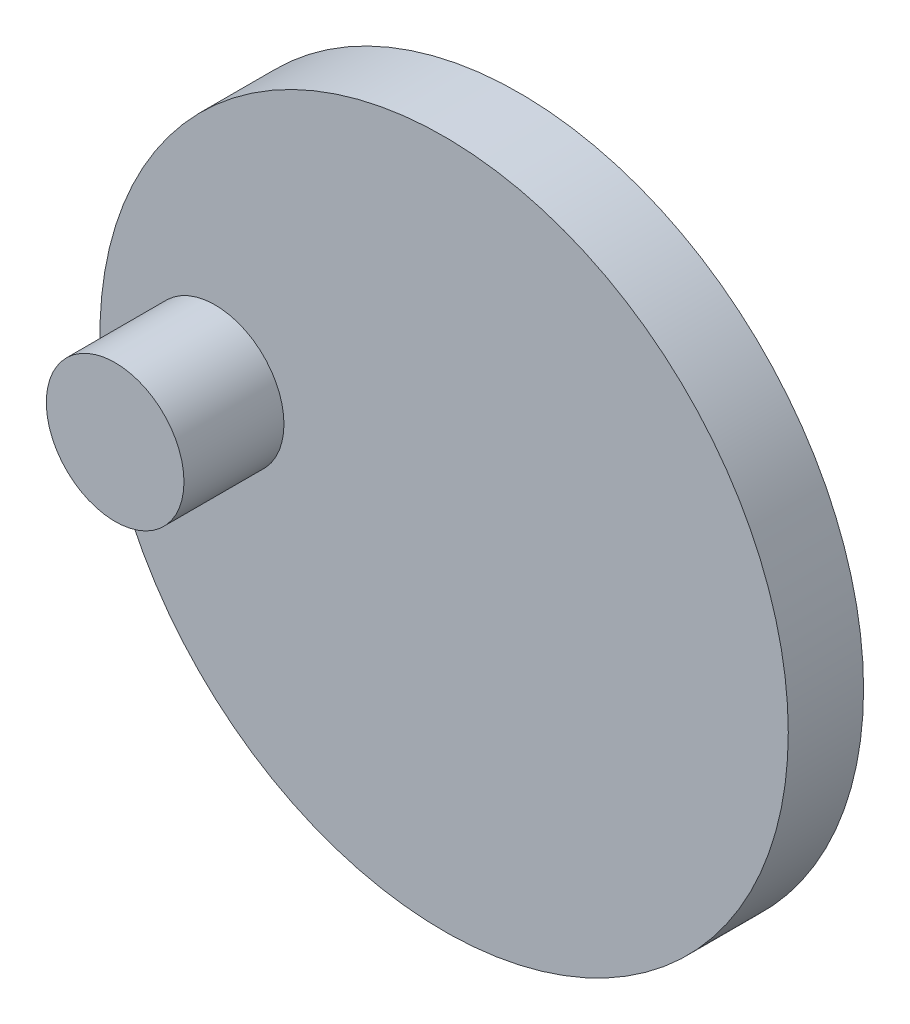
ISO-10303-21;
HEADER;
FILE_DESCRIPTION(('STEP AP214'),'2;1');
FILE_NAME('part.step','',(''),(''),'','','');
FILE_SCHEMA(('AUTOMOTIVE_DESIGN { 1 0 10303 214 1 1 1 1 }'));
ENDSEC;
DATA;
#1=APPLICATION_CONTEXT('core data for automotive mechanical design processes');
#2=APPLICATION_PROTOCOL_DEFINITION('international standard','automotive_design',2000,#1);
#3=PRODUCT_CONTEXT('',#1,'mechanical');
#4=PRODUCT('Part','Part','',(#3));
#5=PRODUCT_RELATED_PRODUCT_CATEGORY('part','',(#4));
#6=PRODUCT_DEFINITION_FORMATION('','',#4);
#7=PRODUCT_DEFINITION_CONTEXT('part definition',#1,'design');
#8=PRODUCT_DEFINITION('design','',#6,#7);
#9=PRODUCT_DEFINITION_SHAPE('','',#8);
#10=(LENGTH_UNIT() NAMED_UNIT(*) SI_UNIT(.MILLI.,.METRE.));
#11=(NAMED_UNIT(*) PLANE_ANGLE_UNIT() SI_UNIT($,.RADIAN.));
#12=(NAMED_UNIT(*) SI_UNIT($,.STERADIAN.) SOLID_ANGLE_UNIT());
#13=UNCERTAINTY_MEASURE_WITH_UNIT(LENGTH_MEASURE(1.E-05),#10,'distance_accuracy_value','');
#14=(GEOMETRIC_REPRESENTATION_CONTEXT(3) GLOBAL_UNCERTAINTY_ASSIGNED_CONTEXT((#13)) GLOBAL_UNIT_ASSIGNED_CONTEXT((#10,
#11,#12)) REPRESENTATION_CONTEXT('',''));
#15=CARTESIAN_POINT('',(0.,0.,0.));
#16=DIRECTION('',(0.,0.,1.));
#17=DIRECTION('',(1.,0.,0.));
#18=AXIS2_PLACEMENT_3D('',#15,#16,#17);
#19=CARTESIAN_POINT('',(0.,0.,-51.7398));
#20=DIRECTION('',(0.,0.,1.));
#21=DIRECTION('',(1.,0.,0.));
#22=AXIS2_PLACEMENT_3D('',#19,#20,#21);
#23=CYLINDRICAL_SURFACE('',#22,101.6);
#24=CARTESIAN_POINT('',(0.,0.,-51.7398));
#25=DIRECTION('',(0.,0.,1.));
#26=DIRECTION('',(1.,0.,0.));
#27=AXIS2_PLACEMENT_3D('',#24,#25,#26);
#28=CIRCLE('',#27,101.6);
#29=CARTESIAN_POINT('',(101.6,0.,-51.7398));
#30=VERTEX_POINT('',#29);
#31=EDGE_CURVE('E10',#30,#30,#28,.T.);
#32=ORIENTED_EDGE('',*,*,#31,.T.);
#33=EDGE_LOOP('',(#32));
#34=FACE_BOUND('',#33,.T.);
#35=CARTESIAN_POINT('',(0.,0.,-29.5148));
#36=DIRECTION('',(0.,0.,1.));
#37=DIRECTION('',(1.,0.,0.));
#38=AXIS2_PLACEMENT_3D('',#35,#36,#37);
#39=CIRCLE('',#38,101.6);
#40=CARTESIAN_POINT('',(101.6,0.,-29.5148));
#41=VERTEX_POINT('',#40);
#42=EDGE_CURVE('E34',#41,#41,#39,.T.);
#43=ORIENTED_EDGE('',*,*,#42,.F.);
#44=EDGE_LOOP('',(#43));
#45=FACE_BOUND('',#44,.T.);
#46=ADVANCED_FACE('F31',(#34,#45),#23,.T.);
#47=CARTESIAN_POINT('',(0.,0.,-51.7398));
#48=DIRECTION('',(0.,0.,1.));
#49=DIRECTION('',(1.,0.,0.));
#50=AXIS2_PLACEMENT_3D('',#47,#48,#49);
#51=PLANE('',#50);
#52=ORIENTED_EDGE('',*,*,#31,.F.);
#53=EDGE_LOOP('',(#52));
#54=FACE_BOUND('',#53,.T.);
#55=ADVANCED_FACE('F61',(#54),#51,.F.);
#56=CARTESIAN_POINT('',(0.,0.,-29.5148));
#57=DIRECTION('',(0.,0.,1.));
#58=DIRECTION('',(1.,0.,0.));
#59=AXIS2_PLACEMENT_3D('',#56,#57,#58);
#60=PLANE('',#59);
#61=CARTESIAN_POINT('',(-67.5929775328971,4.40062598750224,-29.5148));
#62=DIRECTION('',(0.,0.,1.));
#63=DIRECTION('',(1.,0.,0.));
#64=AXIS2_PLACEMENT_3D('',#61,#62,#63);
#65=CIRCLE('',#64,20.3200001345527);
#66=CARTESIAN_POINT('',(-47.2729773983444,4.40062598750224,-29.5148));
#67=VERTEX_POINT('',#66);
#68=EDGE_CURVE('E41',#67,#67,#65,.T.);
#69=ORIENTED_EDGE('',*,*,#68,.F.);
#70=EDGE_LOOP('',(#69));
#71=FACE_BOUND('',#70,.T.);
#72=ORIENTED_EDGE('',*,*,#42,.T.);
#73=EDGE_LOOP('',(#72));
#74=FACE_BOUND('',#73,.T.);
#75=ADVANCED_FACE('F53',(#71,#74),#60,.T.);
#76=CARTESIAN_POINT('',(-67.5929775328971,4.40062598750224,-51.7398));
#77=DIRECTION('',(0.,0.,1.));
#78=DIRECTION('',(1.,0.,0.));
#79=AXIS2_PLACEMENT_3D('',#76,#77,#78);
#80=CYLINDRICAL_SURFACE('',#79,20.3200001345527);
#81=ORIENTED_EDGE('',*,*,#68,.T.);
#82=EDGE_LOOP('',(#81));
#83=FACE_BOUND('',#82,.T.);
#84=CARTESIAN_POINT('',(-67.5929775328971,4.40062598750224,0.));
#85=DIRECTION('',(0.,0.,1.));
#86=DIRECTION('',(1.,0.,0.));
#87=AXIS2_PLACEMENT_3D('',#84,#85,#86);
#88=CIRCLE('',#87,20.3200001345527);
#89=CARTESIAN_POINT('',(-47.2729773983444,4.40062598750224,0.));
#90=VERTEX_POINT('',#89);
#91=EDGE_CURVE('E45',#90,#90,#88,.T.);
#92=ORIENTED_EDGE('',*,*,#91,.F.);
#93=EDGE_LOOP('',(#92));
#94=FACE_BOUND('',#93,.T.);
#95=ADVANCED_FACE('F51',(#83,#94),#80,.T.);
#96=CARTESIAN_POINT('',(-67.5929775328971,4.40062598750224,0.));
#97=DIRECTION('',(0.,0.,1.));
#98=DIRECTION('',(1.,0.,0.));
#99=AXIS2_PLACEMENT_3D('',#96,#97,#98);
#100=PLANE('',#99);
#101=ORIENTED_EDGE('',*,*,#91,.T.);
#102=EDGE_LOOP('',(#101));
#103=FACE_BOUND('',#102,.T.);
#104=ADVANCED_FACE('F49',(#103),#100,.T.);
#105=CLOSED_SHELL('',(#46,#55,#75,#95,#104));
#106=MANIFOLD_SOLID_BREP('B2',#105);
#107=ADVANCED_BREP_SHAPE_REPRESENTATION('',(#18,#106),#14);
#108=SHAPE_DEFINITION_REPRESENTATION(#9,#107);
ENDSEC;
END-ISO-10303-21;
